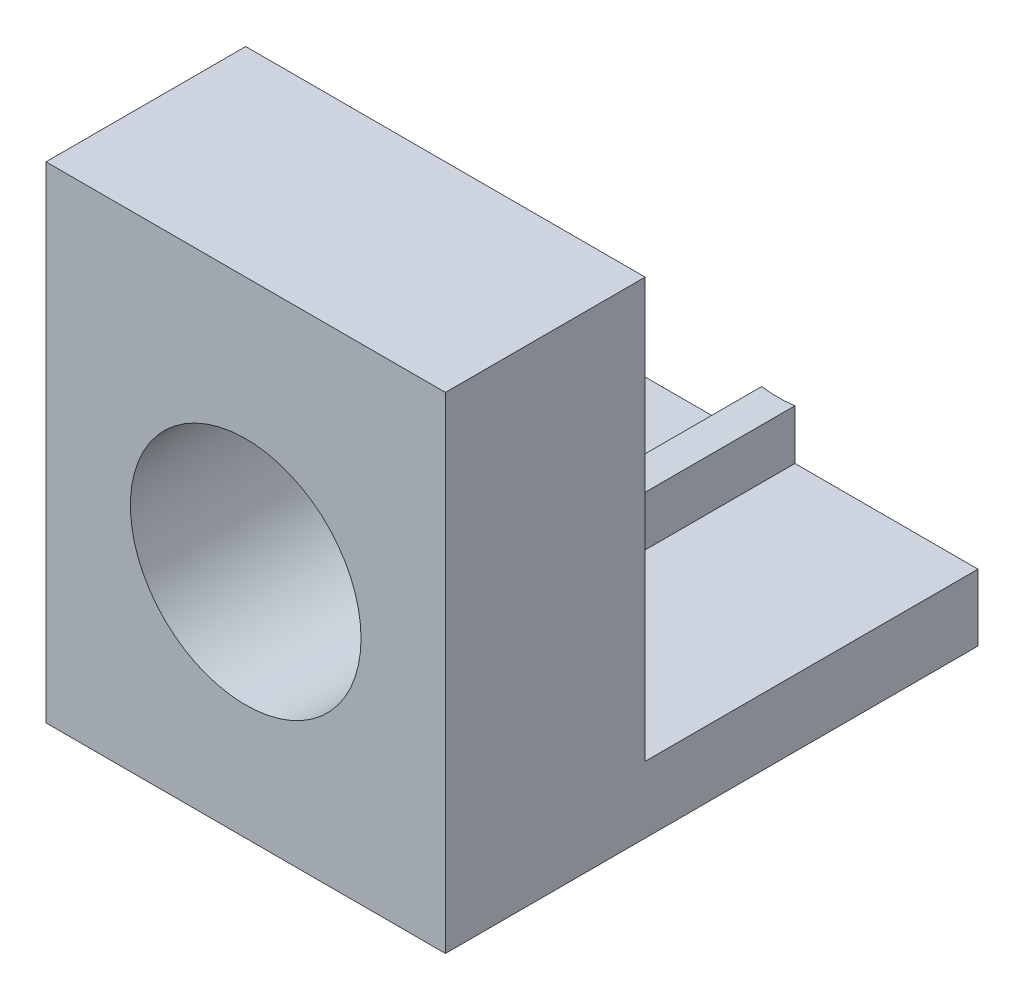
ISO-10303-21;
HEADER;
FILE_DESCRIPTION(('STEP AP214'),'2;1');
FILE_NAME('part.step','',(''),(''),'','','');
FILE_SCHEMA(('AUTOMOTIVE_DESIGN { 1 0 10303 214 1 1 1 1 }'));
ENDSEC;
DATA;
#1=APPLICATION_CONTEXT('core data for automotive mechanical design processes');
#2=APPLICATION_PROTOCOL_DEFINITION('international standard','automotive_design',2000,#1);
#3=PRODUCT_CONTEXT('',#1,'mechanical');
#4=PRODUCT('Part','Part','',(#3));
#5=PRODUCT_RELATED_PRODUCT_CATEGORY('part','',(#4));
#6=PRODUCT_DEFINITION_FORMATION('','',#4);
#7=PRODUCT_DEFINITION_CONTEXT('part definition',#1,'design');
#8=PRODUCT_DEFINITION('design','',#6,#7);
#9=PRODUCT_DEFINITION_SHAPE('','',#8);
#10=(LENGTH_UNIT() NAMED_UNIT(*) SI_UNIT(.MILLI.,.METRE.));
#11=(NAMED_UNIT(*) PLANE_ANGLE_UNIT() SI_UNIT($,.RADIAN.));
#12=(NAMED_UNIT(*) SI_UNIT($,.STERADIAN.) SOLID_ANGLE_UNIT());
#13=UNCERTAINTY_MEASURE_WITH_UNIT(LENGTH_MEASURE(1.E-05),#10,'distance_accuracy_value','');
#14=(GEOMETRIC_REPRESENTATION_CONTEXT(3) GLOBAL_UNCERTAINTY_ASSIGNED_CONTEXT((#13)) GLOBAL_UNIT_ASSIGNED_CONTEXT((#10,
#11,#12)) REPRESENTATION_CONTEXT('',''));
#15=CARTESIAN_POINT('',(0.,0.,0.));
#16=DIRECTION('',(0.,0.,1.));
#17=DIRECTION('',(1.,0.,0.));
#18=AXIS2_PLACEMENT_3D('',#15,#16,#17);
#19=CARTESIAN_POINT('',(0.,6.35,0.));
#20=DIRECTION('',(0.,1.,0.));
#21=DIRECTION('',(0.,0.,1.));
#22=AXIS2_PLACEMENT_3D('',#19,#20,#21);
#23=PLANE('',#22);
#24=DIRECTION('',(0.,0.,1.));
#25=VECTOR('',#24,1.);
#26=CARTESIAN_POINT('',(-19.05,6.35,-25.4));
#27=LINE('',#26,#25);
#28=CARTESIAN_POINT('',(-19.05,6.35,-25.4));
#29=VERTEX_POINT('',#28);
#30=CARTESIAN_POINT('',(-19.05,6.35,6.34999999999999));
#31=VERTEX_POINT('',#30);
#32=EDGE_CURVE('E59',#29,#31,#27,.T.);
#33=ORIENTED_EDGE('',*,*,#32,.T.);
#34=DIRECTION('',(-1.,0.,0.));
#35=VECTOR('',#34,1.);
#36=CARTESIAN_POINT('',(19.05,6.35,6.34999999999999));
#37=LINE('',#36,#35);
#38=CARTESIAN_POINT('',(-1.5875,6.35,6.34999999999999));
#39=VERTEX_POINT('',#38);
#40=EDGE_CURVE('E128',#39,#31,#37,.T.);
#41=ORIENTED_EDGE('',*,*,#40,.F.);
#42=DIRECTION('',(0.,0.,1.));
#43=VECTOR('',#42,1.);
#44=CARTESIAN_POINT('',(-1.5875,6.35,-25.4));
#45=LINE('',#44,#43);
#46=CARTESIAN_POINT('',(-1.58750000000001,6.35,-25.4));
#47=VERTEX_POINT('',#46);
#48=EDGE_CURVE('E140',#47,#39,#45,.T.);
#49=ORIENTED_EDGE('',*,*,#48,.F.);
#50=DIRECTION('',(-1.,0.,0.));
#51=VECTOR('',#50,1.);
#52=CARTESIAN_POINT('',(-19.05,6.35,-25.4));
#53=LINE('',#52,#51);
#54=EDGE_CURVE('E133',#47,#29,#53,.T.);
#55=ORIENTED_EDGE('',*,*,#54,.T.);
#56=EDGE_LOOP('',(#33,#41,#49,#55));
#57=FACE_BOUND('',#56,.T.);
#58=ADVANCED_FACE('F37',(#57),#23,.T.);
#59=DIRECTION('',(0.,0.,-1.));
#60=VECTOR('',#59,1.);
#61=CARTESIAN_POINT('',(1.5875,6.35,-25.4));
#62=LINE('',#61,#60);
#63=CARTESIAN_POINT('',(1.5875,6.35,6.34999999999999));
#64=VERTEX_POINT('',#63);
#65=CARTESIAN_POINT('',(1.5875,6.35,-25.4));
#66=VERTEX_POINT('',#65);
#67=EDGE_CURVE('E135',#64,#66,#62,.T.);
#68=ORIENTED_EDGE('',*,*,#67,.F.);
#69=CARTESIAN_POINT('',(19.05,6.35,6.34999999999999));
#70=VERTEX_POINT('',#69);
#71=EDGE_CURVE('E198',#70,#64,#37,.T.);
#72=ORIENTED_EDGE('',*,*,#71,.F.);
#73=DIRECTION('',(0.,0.,-1.));
#74=VECTOR('',#73,1.);
#75=CARTESIAN_POINT('',(19.05,6.35,-25.4));
#76=LINE('',#75,#74);
#77=CARTESIAN_POINT('',(19.05,6.35,-25.4));
#78=VERTEX_POINT('',#77);
#79=EDGE_CURVE('E144',#70,#78,#76,.T.);
#80=ORIENTED_EDGE('',*,*,#79,.T.);
#81=EDGE_CURVE('E147',#78,#66,#53,.T.);
#82=ORIENTED_EDGE('',*,*,#81,.T.);
#83=EDGE_LOOP('',(#68,#72,#80,#82));
#84=FACE_BOUND('',#83,.T.);
#85=ADVANCED_FACE('F229',(#84),#23,.T.);
#86=CARTESIAN_POINT('',(-1.5875,12.7,-25.4));
#87=DIRECTION('',(1.,0.,0.));
#88=DIRECTION('',(0.,0.,-1.));
#89=AXIS2_PLACEMENT_3D('',#86,#87,#88);
#90=PLANE('',#89);
#91=DIRECTION('',(0.,-1.,0.));
#92=VECTOR('',#91,1.);
#93=CARTESIAN_POINT('',(-1.5875,12.7,6.35));
#94=LINE('',#93,#92);
#95=CARTESIAN_POINT('',(-1.5875,11.115155318058,6.35));
#96=VERTEX_POINT('',#95);
#97=EDGE_CURVE('E127',#96,#39,#94,.T.);
#98=ORIENTED_EDGE('',*,*,#97,.F.);
#99=DIRECTION('',(0.,0.,1.));
#100=VECTOR('',#99,1.);
#101=CARTESIAN_POINT('',(-1.5875,11.115155318058,-25.4));
#102=LINE('',#101,#100);
#103=CARTESIAN_POINT('',(-1.5875,11.115155318058,-25.4));
#104=VERTEX_POINT('',#103);
#105=EDGE_CURVE('E52',#96,#104,#102,.F.);
#106=ORIENTED_EDGE('',*,*,#105,.T.);
#107=DIRECTION('',(0.,-1.,0.));
#108=VECTOR('',#107,1.);
#109=CARTESIAN_POINT('',(-1.5875,12.7,-25.4));
#110=LINE('',#109,#108);
#111=EDGE_CURVE('E125',#104,#47,#110,.T.);
#112=ORIENTED_EDGE('',*,*,#111,.T.);
#113=ORIENTED_EDGE('',*,*,#48,.T.);
#114=EDGE_LOOP('',(#98,#106,#112,#113));
#115=FACE_BOUND('',#114,.T.);
#116=ADVANCED_FACE('F123',(#115),#90,.F.);
#117=CARTESIAN_POINT('',(1.5875,12.7,-25.4));
#118=DIRECTION('',(-1.,0.,0.));
#119=DIRECTION('',(0.,0.,1.));
#120=AXIS2_PLACEMENT_3D('',#117,#118,#119);
#121=PLANE('',#120);
#122=DIRECTION('',(0.,-1.,0.));
#123=VECTOR('',#122,1.);
#124=CARTESIAN_POINT('',(1.5875,12.7,-25.4));
#125=LINE('',#124,#123);
#126=CARTESIAN_POINT('',(1.5875,11.115155318058,-25.4));
#127=VERTEX_POINT('',#126);
#128=EDGE_CURVE('E134',#127,#66,#125,.T.);
#129=ORIENTED_EDGE('',*,*,#128,.F.);
#130=DIRECTION('',(0.,0.,1.));
#131=VECTOR('',#130,1.);
#132=CARTESIAN_POINT('',(1.5875,11.115155318058,-25.4));
#133=LINE('',#132,#131);
#134=CARTESIAN_POINT('',(1.5875,11.115155318058,6.35));
#135=VERTEX_POINT('',#134);
#136=EDGE_CURVE('E115',#127,#135,#133,.T.);
#137=ORIENTED_EDGE('',*,*,#136,.T.);
#138=DIRECTION('',(0.,1.,0.));
#139=VECTOR('',#138,1.);
#140=CARTESIAN_POINT('',(1.5875,12.7,6.35));
#141=LINE('',#140,#139);
#142=EDGE_CURVE('E204',#64,#135,#141,.T.);
#143=ORIENTED_EDGE('',*,*,#142,.F.);
#144=ORIENTED_EDGE('',*,*,#67,.T.);
#145=EDGE_LOOP('',(#129,#137,#143,#144));
#146=FACE_BOUND('',#145,.T.);
#147=ADVANCED_FACE('F239',(#146),#121,.F.);
#148=CARTESIAN_POINT('',(19.05,6.35,-25.4));
#149=DIRECTION('',(-1.,0.,0.));
#150=DIRECTION('',(0.,0.,1.));
#151=AXIS2_PLACEMENT_3D('',#148,#149,#150);
#152=PLANE('',#151);
#153=DIRECTION('',(0.,0.,-1.));
#154=VECTOR('',#153,1.);
#155=CARTESIAN_POINT('',(19.05,0.,-25.4));
#156=LINE('',#155,#154);
#157=CARTESIAN_POINT('',(19.05,0.,25.4));
#158=VERTEX_POINT('',#157);
#159=CARTESIAN_POINT('',(19.05,0.,-25.4));
#160=VERTEX_POINT('',#159);
#161=EDGE_CURVE('E137',#158,#160,#156,.T.);
#162=ORIENTED_EDGE('',*,*,#161,.T.);
#163=DIRECTION('',(0.,-1.,0.));
#164=VECTOR('',#163,1.);
#165=CARTESIAN_POINT('',(19.05,6.35,-25.4));
#166=LINE('',#165,#164);
#167=EDGE_CURVE('E45',#78,#160,#166,.T.);
#168=ORIENTED_EDGE('',*,*,#167,.F.);
#169=ORIENTED_EDGE('',*,*,#79,.F.);
#170=DIRECTION('',(0.,-1.,0.));
#171=VECTOR('',#170,1.);
#172=CARTESIAN_POINT('',(19.05,46.35,6.34999999999999));
#173=LINE('',#172,#171);
#174=CARTESIAN_POINT('',(19.05,46.35,6.34999999999999));
#175=VERTEX_POINT('',#174);
#176=EDGE_CURVE('E192',#175,#70,#173,.T.);
#177=ORIENTED_EDGE('',*,*,#176,.F.);
#178=DIRECTION('',(0.,0.,-1.));
#179=VECTOR('',#178,1.);
#180=CARTESIAN_POINT('',(19.05,46.35,25.4));
#181=LINE('',#180,#179);
#182=CARTESIAN_POINT('',(19.05,46.35,25.4));
#183=VERTEX_POINT('',#182);
#184=EDGE_CURVE('E200',#183,#175,#181,.T.);
#185=ORIENTED_EDGE('',*,*,#184,.F.);
#186=DIRECTION('',(0.,-1.,0.));
#187=VECTOR('',#186,1.);
#188=CARTESIAN_POINT('',(19.05,6.35,25.4));
#189=LINE('',#188,#187);
#190=EDGE_CURVE('E151',#183,#158,#189,.T.);
#191=ORIENTED_EDGE('',*,*,#190,.T.);
#192=EDGE_LOOP('',(#162,#168,#169,#177,#185,#191));
#193=FACE_BOUND('',#192,.T.);
#194=ADVANCED_FACE('F39',(#193),#152,.F.);
#195=CARTESIAN_POINT('',(-19.05,6.35,-25.4));
#196=DIRECTION('',(0.,0.,1.));
#197=DIRECTION('',(1.,0.,0.));
#198=AXIS2_PLACEMENT_3D('',#195,#196,#197);
#199=PLANE('',#198);
#200=ORIENTED_EDGE('',*,*,#111,.F.);
#201=CARTESIAN_POINT('',(0.,22.,-25.4));
#202=DIRECTION('',(0.,0.,1.));
#203=DIRECTION('',(1.,0.,0.));
#204=AXIS2_PLACEMENT_3D('',#201,#202,#203);
#205=CIRCLE('',#204,11.);
#206=EDGE_CURVE('E112',#104,#127,#205,.T.);
#207=ORIENTED_EDGE('',*,*,#206,.T.);
#208=ORIENTED_EDGE('',*,*,#128,.T.);
#209=ORIENTED_EDGE('',*,*,#81,.F.);
#210=ORIENTED_EDGE('',*,*,#167,.T.);
#211=DIRECTION('',(-1.,0.,0.));
#212=VECTOR('',#211,1.);
#213=CARTESIAN_POINT('',(-19.05,0.,-25.4));
#214=LINE('',#213,#212);
#215=CARTESIAN_POINT('',(-19.05,0.,-25.4));
#216=VERTEX_POINT('',#215);
#217=EDGE_CURVE('E154',#160,#216,#214,.T.);
#218=ORIENTED_EDGE('',*,*,#217,.T.);
#219=DIRECTION('',(0.,-1.,0.));
#220=VECTOR('',#219,1.);
#221=CARTESIAN_POINT('',(-19.05,6.35,-25.4));
#222=LINE('',#221,#220);
#223=EDGE_CURVE('E164',#29,#216,#222,.T.);
#224=ORIENTED_EDGE('',*,*,#223,.F.);
#225=ORIENTED_EDGE('',*,*,#54,.F.);
#226=EDGE_LOOP('',(#200,#207,#208,#209,#210,#218,#224,#225));
#227=FACE_BOUND('',#226,.T.);
#228=ADVANCED_FACE('F131',(#227),#199,.F.);
#229=CARTESIAN_POINT('',(-19.05,6.35,-25.4));
#230=DIRECTION('',(1.,0.,0.));
#231=DIRECTION('',(0.,0.,-1.));
#232=AXIS2_PLACEMENT_3D('',#229,#230,#231);
#233=PLANE('',#232);
#234=DIRECTION('',(0.,0.,1.));
#235=VECTOR('',#234,1.);
#236=CARTESIAN_POINT('',(-19.05,0.,-25.4));
#237=LINE('',#236,#235);
#238=CARTESIAN_POINT('',(-19.05,0.,25.4));
#239=VERTEX_POINT('',#238);
#240=EDGE_CURVE('E156',#216,#239,#237,.T.);
#241=ORIENTED_EDGE('',*,*,#240,.T.);
#242=DIRECTION('',(0.,-1.,0.));
#243=VECTOR('',#242,1.);
#244=CARTESIAN_POINT('',(-19.05,6.35,25.4));
#245=LINE('',#244,#243);
#246=CARTESIAN_POINT('',(-19.05,46.35,25.4));
#247=VERTEX_POINT('',#246);
#248=EDGE_CURVE('E161',#247,#239,#245,.T.);
#249=ORIENTED_EDGE('',*,*,#248,.F.);
#250=DIRECTION('',(0.,0.,1.));
#251=VECTOR('',#250,1.);
#252=CARTESIAN_POINT('',(-19.05,46.35,25.4));
#253=LINE('',#252,#251);
#254=CARTESIAN_POINT('',(-19.05,46.35,6.35));
#255=VERTEX_POINT('',#254);
#256=EDGE_CURVE('E189',#255,#247,#253,.T.);
#257=ORIENTED_EDGE('',*,*,#256,.F.);
#258=DIRECTION('',(0.,-1.,0.));
#259=VECTOR('',#258,1.);
#260=CARTESIAN_POINT('',(-19.05,46.35,6.35));
#261=LINE('',#260,#259);
#262=EDGE_CURVE('E188',#255,#31,#261,.T.);
#263=ORIENTED_EDGE('',*,*,#262,.T.);
#264=ORIENTED_EDGE('',*,*,#32,.F.);
#265=ORIENTED_EDGE('',*,*,#223,.T.);
#266=EDGE_LOOP('',(#241,#249,#257,#263,#264,#265));
#267=FACE_BOUND('',#266,.T.);
#268=ADVANCED_FACE('F178',(#267),#233,.F.);
#269=CARTESIAN_POINT('',(-19.05,6.35,25.4));
#270=DIRECTION('',(0.,0.,-1.));
#271=DIRECTION('',(-1.,0.,0.));
#272=AXIS2_PLACEMENT_3D('',#269,#270,#271);
#273=PLANE('',#272);
#274=CARTESIAN_POINT('',(0.,22.,25.4));
#275=DIRECTION('',(0.,0.,1.));
#276=DIRECTION('',(1.,0.,0.));
#277=AXIS2_PLACEMENT_3D('',#274,#275,#276);
#278=CIRCLE('',#277,11.);
#279=CARTESIAN_POINT('',(11.,22.,25.4));
#280=VERTEX_POINT('',#279);
#281=EDGE_CURVE('E119',#280,#280,#278,.T.);
#282=ORIENTED_EDGE('',*,*,#281,.F.);
#283=EDGE_LOOP('',(#282));
#284=FACE_BOUND('',#283,.T.);
#285=DIRECTION('',(1.,0.,0.));
#286=VECTOR('',#285,1.);
#287=CARTESIAN_POINT('',(19.05,46.35,25.4));
#288=LINE('',#287,#286);
#289=EDGE_CURVE('E185',#247,#183,#288,.T.);
#290=ORIENTED_EDGE('',*,*,#289,.F.);
#291=ORIENTED_EDGE('',*,*,#248,.T.);
#292=DIRECTION('',(1.,0.,0.));
#293=VECTOR('',#292,1.);
#294=CARTESIAN_POINT('',(-19.05,0.,25.4));
#295=LINE('',#294,#293);
#296=EDGE_CURVE('E146',#239,#158,#295,.T.);
#297=ORIENTED_EDGE('',*,*,#296,.T.);
#298=ORIENTED_EDGE('',*,*,#190,.F.);
#299=EDGE_LOOP('',(#290,#291,#297,#298));
#300=FACE_BOUND('',#299,.T.);
#301=ADVANCED_FACE('F183',(#284,#300),#273,.F.);
#302=CARTESIAN_POINT('',(0.,0.,0.));
#303=DIRECTION('',(0.,1.,0.));
#304=DIRECTION('',(0.,0.,1.));
#305=AXIS2_PLACEMENT_3D('',#302,#303,#304);
#306=PLANE('',#305);
#307=ORIENTED_EDGE('',*,*,#161,.F.);
#308=ORIENTED_EDGE('',*,*,#296,.F.);
#309=ORIENTED_EDGE('',*,*,#240,.F.);
#310=ORIENTED_EDGE('',*,*,#217,.F.);
#311=EDGE_LOOP('',(#307,#308,#309,#310));
#312=FACE_BOUND('',#311,.T.);
#313=ADVANCED_FACE('F175',(#312),#306,.F.);
#314=CARTESIAN_POINT('',(19.05,46.35,6.34999999999999));
#315=DIRECTION('',(0.,0.,1.));
#316=DIRECTION('',(1.,0.,0.));
#317=AXIS2_PLACEMENT_3D('',#314,#315,#316);
#318=PLANE('',#317);
#319=ORIENTED_EDGE('',*,*,#142,.T.);
#320=CARTESIAN_POINT('',(0.,22.,6.35));
#321=DIRECTION('',(0.,0.,1.));
#322=DIRECTION('',(1.,0.,0.));
#323=AXIS2_PLACEMENT_3D('',#320,#321,#322);
#324=CIRCLE('',#323,11.);
#325=EDGE_CURVE('E11',#135,#96,#324,.T.);
#326=ORIENTED_EDGE('',*,*,#325,.T.);
#327=ORIENTED_EDGE('',*,*,#97,.T.);
#328=ORIENTED_EDGE('',*,*,#40,.T.);
#329=ORIENTED_EDGE('',*,*,#262,.F.);
#330=DIRECTION('',(-1.,0.,0.));
#331=VECTOR('',#330,1.);
#332=CARTESIAN_POINT('',(19.05,46.35,6.34999999999999));
#333=LINE('',#332,#331);
#334=EDGE_CURVE('E194',#175,#255,#333,.T.);
#335=ORIENTED_EDGE('',*,*,#334,.F.);
#336=ORIENTED_EDGE('',*,*,#176,.T.);
#337=ORIENTED_EDGE('',*,*,#71,.T.);
#338=EDGE_LOOP('',(#319,#326,#327,#328,#329,#335,#336,#337));
#339=FACE_BOUND('',#338,.T.);
#340=ADVANCED_FACE('F209',(#339),#318,.F.);
#341=CARTESIAN_POINT('',(0.,46.35,0.));
#342=DIRECTION('',(0.,1.,0.));
#343=DIRECTION('',(0.,0.,1.));
#344=AXIS2_PLACEMENT_3D('',#341,#342,#343);
#345=PLANE('',#344);
#346=ORIENTED_EDGE('',*,*,#184,.T.);
#347=ORIENTED_EDGE('',*,*,#334,.T.);
#348=ORIENTED_EDGE('',*,*,#256,.T.);
#349=ORIENTED_EDGE('',*,*,#289,.T.);
#350=EDGE_LOOP('',(#346,#347,#348,#349));
#351=FACE_BOUND('',#350,.T.);
#352=ADVANCED_FACE('F210',(#351),#345,.T.);
#353=CARTESIAN_POINT('',(0.,22.,-25.4));
#354=DIRECTION('',(0.,0.,1.));
#355=DIRECTION('',(1.,0.,0.));
#356=AXIS2_PLACEMENT_3D('',#353,#354,#355);
#357=CYLINDRICAL_SURFACE('',#356,11.);
#358=ORIENTED_EDGE('',*,*,#281,.T.);
#359=EDGE_LOOP('',(#358));
#360=FACE_BOUND('',#359,.T.);
#361=ORIENTED_EDGE('',*,*,#325,.F.);
#362=ORIENTED_EDGE('',*,*,#136,.F.);
#363=ORIENTED_EDGE('',*,*,#206,.F.);
#364=ORIENTED_EDGE('',*,*,#105,.F.);
#365=EDGE_LOOP('',(#361,#362,#363,#364));
#366=FACE_BOUND('',#365,.T.);
#367=ADVANCED_FACE('F113',(#360,#366),#357,.F.);
#368=CLOSED_SHELL('',(#58,#85,#116,#147,#194,#228,#268,#301,#313,#340,#352,#367));
#369=MANIFOLD_SOLID_BREP('B2',#368);
#370=ADVANCED_BREP_SHAPE_REPRESENTATION('',(#18,#369),#14);
#371=SHAPE_DEFINITION_REPRESENTATION(#9,#370);
ENDSEC;
END-ISO-10303-21;
